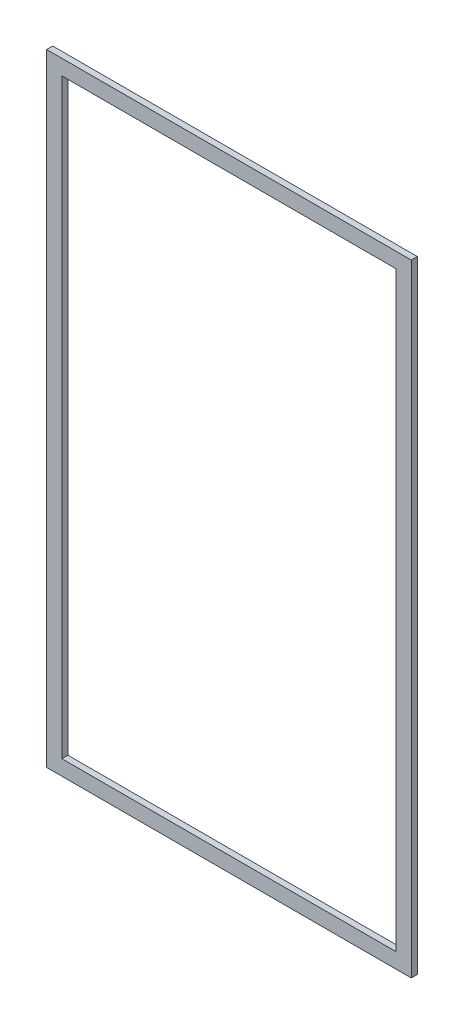
ISO-10303-21;
HEADER;
FILE_DESCRIPTION(('STEP AP214'),'2;1');
FILE_NAME('part.step','',(''),(''),'','','');
FILE_SCHEMA(('AUTOMOTIVE_DESIGN { 1 0 10303 214 1 1 1 1 }'));
ENDSEC;
DATA;
#1=APPLICATION_CONTEXT('core data for automotive mechanical design processes');
#2=APPLICATION_PROTOCOL_DEFINITION('international standard','automotive_design',2000,#1);
#3=PRODUCT_CONTEXT('',#1,'mechanical');
#4=PRODUCT('Part','Part','',(#3));
#5=PRODUCT_RELATED_PRODUCT_CATEGORY('part','',(#4));
#6=PRODUCT_DEFINITION_FORMATION('','',#4);
#7=PRODUCT_DEFINITION_CONTEXT('part definition',#1,'design');
#8=PRODUCT_DEFINITION('design','',#6,#7);
#9=PRODUCT_DEFINITION_SHAPE('','',#8);
#10=(LENGTH_UNIT() NAMED_UNIT(*) SI_UNIT(.MILLI.,.METRE.));
#11=(NAMED_UNIT(*) PLANE_ANGLE_UNIT() SI_UNIT($,.RADIAN.));
#12=(NAMED_UNIT(*) SI_UNIT($,.STERADIAN.) SOLID_ANGLE_UNIT());
#13=UNCERTAINTY_MEASURE_WITH_UNIT(LENGTH_MEASURE(1.E-05),#10,'distance_accuracy_value','');
#14=(GEOMETRIC_REPRESENTATION_CONTEXT(3) GLOBAL_UNCERTAINTY_ASSIGNED_CONTEXT((#13)) GLOBAL_UNIT_ASSIGNED_CONTEXT((#10,
#11,#12)) REPRESENTATION_CONTEXT('',''));
#15=CARTESIAN_POINT('',(0.,0.,0.));
#16=DIRECTION('',(0.,0.,1.));
#17=DIRECTION('',(1.,0.,0.));
#18=AXIS2_PLACEMENT_3D('',#15,#16,#17);
#19=CARTESIAN_POINT('',(0.,0.,10.));
#20=DIRECTION('',(0.,0.,1.));
#21=DIRECTION('',(1.,0.,0.));
#22=AXIS2_PLACEMENT_3D('',#19,#20,#21);
#23=PLANE('',#22);
#24=DIRECTION('',(0.,-1.,0.));
#25=VECTOR('',#24,1.);
#26=CARTESIAN_POINT('',(-300.,-511.5,10.));
#27=LINE('',#26,#25);
#28=CARTESIAN_POINT('',(-300.,511.5,10.));
#29=VERTEX_POINT('',#28);
#30=CARTESIAN_POINT('',(-300.,-511.5,10.));
#31=VERTEX_POINT('',#30);
#32=EDGE_CURVE('E134',#29,#31,#27,.T.);
#33=ORIENTED_EDGE('',*,*,#32,.T.);
#34=DIRECTION('',(1.,0.,0.));
#35=VECTOR('',#34,1.);
#36=CARTESIAN_POINT('',(300.,-511.5,10.));
#37=LINE('',#36,#35);
#38=CARTESIAN_POINT('',(300.,-511.5,10.));
#39=VERTEX_POINT('',#38);
#40=EDGE_CURVE('E137',#31,#39,#37,.T.);
#41=ORIENTED_EDGE('',*,*,#40,.T.);
#42=DIRECTION('',(0.,1.,0.));
#43=VECTOR('',#42,1.);
#44=CARTESIAN_POINT('',(300.,-511.5,10.));
#45=LINE('',#44,#43);
#46=CARTESIAN_POINT('',(300.,511.5,10.));
#47=VERTEX_POINT('',#46);
#48=EDGE_CURVE('E140',#39,#47,#45,.T.);
#49=ORIENTED_EDGE('',*,*,#48,.T.);
#50=DIRECTION('',(-1.,0.,0.));
#51=VECTOR('',#50,1.);
#52=CARTESIAN_POINT('',(300.,511.5,10.));
#53=LINE('',#52,#51);
#54=EDGE_CURVE('E142',#47,#29,#53,.T.);
#55=ORIENTED_EDGE('',*,*,#54,.T.);
#56=EDGE_LOOP('',(#33,#41,#49,#55));
#57=FACE_BOUND('',#56,.T.);
#58=DIRECTION('',(1.,0.,0.));
#59=VECTOR('',#58,1.);
#60=CARTESIAN_POINT('',(275.,-486.5,10.));
#61=LINE('',#60,#59);
#62=CARTESIAN_POINT('',(-275.,-486.5,10.));
#63=VERTEX_POINT('',#62);
#64=CARTESIAN_POINT('',(275.,-486.5,10.));
#65=VERTEX_POINT('',#64);
#66=EDGE_CURVE('E106',#63,#65,#61,.T.);
#67=ORIENTED_EDGE('',*,*,#66,.F.);
#68=DIRECTION('',(0.,-1.,0.));
#69=VECTOR('',#68,1.);
#70=CARTESIAN_POINT('',(-275.,-486.5,10.));
#71=LINE('',#70,#69);
#72=CARTESIAN_POINT('',(-275.,486.5,10.));
#73=VERTEX_POINT('',#72);
#74=EDGE_CURVE('E98',#73,#63,#71,.T.);
#75=ORIENTED_EDGE('',*,*,#74,.F.);
#76=DIRECTION('',(-1.,0.,0.));
#77=VECTOR('',#76,1.);
#78=CARTESIAN_POINT('',(275.,486.5,10.));
#79=LINE('',#78,#77);
#80=CARTESIAN_POINT('',(275.,486.5,10.));
#81=VERTEX_POINT('',#80);
#82=EDGE_CURVE('E120',#81,#73,#79,.T.);
#83=ORIENTED_EDGE('',*,*,#82,.F.);
#84=DIRECTION('',(0.,1.,0.));
#85=VECTOR('',#84,1.);
#86=CARTESIAN_POINT('',(275.,-486.5,10.));
#87=LINE('',#86,#85);
#88=EDGE_CURVE('E118',#65,#81,#87,.T.);
#89=ORIENTED_EDGE('',*,*,#88,.F.);
#90=EDGE_LOOP('',(#67,#75,#83,#89));
#91=FACE_BOUND('',#90,.T.);
#92=ADVANCED_FACE('F33',(#57,#91),#23,.T.);
#93=CARTESIAN_POINT('',(0.,0.,0.));
#94=DIRECTION('',(0.,0.,1.));
#95=DIRECTION('',(1.,0.,0.));
#96=AXIS2_PLACEMENT_3D('',#93,#94,#95);
#97=PLANE('',#96);
#98=DIRECTION('',(0.,-1.,0.));
#99=VECTOR('',#98,1.);
#100=CARTESIAN_POINT('',(-300.,-511.5,0.));
#101=LINE('',#100,#99);
#102=CARTESIAN_POINT('',(-300.,511.5,0.));
#103=VERTEX_POINT('',#102);
#104=CARTESIAN_POINT('',(-300.,-511.5,0.));
#105=VERTEX_POINT('',#104);
#106=EDGE_CURVE('E114',#103,#105,#101,.T.);
#107=ORIENTED_EDGE('',*,*,#106,.F.);
#108=DIRECTION('',(-1.,0.,0.));
#109=VECTOR('',#108,1.);
#110=CARTESIAN_POINT('',(300.,511.5,0.));
#111=LINE('',#110,#109);
#112=CARTESIAN_POINT('',(300.,511.5,0.));
#113=VERTEX_POINT('',#112);
#114=EDGE_CURVE('E138',#113,#103,#111,.T.);
#115=ORIENTED_EDGE('',*,*,#114,.F.);
#116=DIRECTION('',(0.,1.,0.));
#117=VECTOR('',#116,1.);
#118=CARTESIAN_POINT('',(300.,-511.5,0.));
#119=LINE('',#118,#117);
#120=CARTESIAN_POINT('',(300.,-511.5,0.));
#121=VERTEX_POINT('',#120);
#122=EDGE_CURVE('E149',#121,#113,#119,.T.);
#123=ORIENTED_EDGE('',*,*,#122,.F.);
#124=DIRECTION('',(1.,0.,0.));
#125=VECTOR('',#124,1.);
#126=CARTESIAN_POINT('',(300.,-511.5,0.));
#127=LINE('',#126,#125);
#128=EDGE_CURVE('E147',#105,#121,#127,.T.);
#129=ORIENTED_EDGE('',*,*,#128,.F.);
#130=EDGE_LOOP('',(#107,#115,#123,#129));
#131=FACE_BOUND('',#130,.T.);
#132=DIRECTION('',(0.,-1.,0.));
#133=VECTOR('',#132,1.);
#134=CARTESIAN_POINT('',(-275.,-486.5,0.));
#135=LINE('',#134,#133);
#136=CARTESIAN_POINT('',(-275.,486.5,0.));
#137=VERTEX_POINT('',#136);
#138=CARTESIAN_POINT('',(-275.,-486.5,0.));
#139=VERTEX_POINT('',#138);
#140=EDGE_CURVE('E56',#137,#139,#135,.T.);
#141=ORIENTED_EDGE('',*,*,#140,.T.);
#142=DIRECTION('',(1.,0.,0.));
#143=VECTOR('',#142,1.);
#144=CARTESIAN_POINT('',(275.,-486.5,0.));
#145=LINE('',#144,#143);
#146=CARTESIAN_POINT('',(275.,-486.5,0.));
#147=VERTEX_POINT('',#146);
#148=EDGE_CURVE('E113',#139,#147,#145,.T.);
#149=ORIENTED_EDGE('',*,*,#148,.T.);
#150=DIRECTION('',(0.,1.,0.));
#151=VECTOR('',#150,1.);
#152=CARTESIAN_POINT('',(275.,-486.5,0.));
#153=LINE('',#152,#151);
#154=CARTESIAN_POINT('',(275.,486.5,0.));
#155=VERTEX_POINT('',#154);
#156=EDGE_CURVE('E126',#147,#155,#153,.T.);
#157=ORIENTED_EDGE('',*,*,#156,.T.);
#158=DIRECTION('',(-1.,0.,0.));
#159=VECTOR('',#158,1.);
#160=CARTESIAN_POINT('',(275.,486.5,0.));
#161=LINE('',#160,#159);
#162=EDGE_CURVE('E107',#155,#137,#161,.T.);
#163=ORIENTED_EDGE('',*,*,#162,.T.);
#164=EDGE_LOOP('',(#141,#149,#157,#163));
#165=FACE_BOUND('',#164,.T.);
#166=ADVANCED_FACE('F167',(#131,#165),#97,.F.);
#167=CARTESIAN_POINT('',(-300.,-511.5,10.));
#168=DIRECTION('',(1.,0.,0.));
#169=DIRECTION('',(0.,1.,0.));
#170=AXIS2_PLACEMENT_3D('',#167,#168,#169);
#171=PLANE('',#170);
#172=ORIENTED_EDGE('',*,*,#106,.T.);
#173=DIRECTION('',(0.,0.,-1.));
#174=VECTOR('',#173,1.);
#175=CARTESIAN_POINT('',(-300.,-511.5,10.));
#176=LINE('',#175,#174);
#177=EDGE_CURVE('E11',#31,#105,#176,.T.);
#178=ORIENTED_EDGE('',*,*,#177,.F.);
#179=ORIENTED_EDGE('',*,*,#32,.F.);
#180=DIRECTION('',(0.,0.,-1.));
#181=VECTOR('',#180,1.);
#182=CARTESIAN_POINT('',(-300.,511.5,10.));
#183=LINE('',#182,#181);
#184=EDGE_CURVE('E144',#29,#103,#183,.T.);
#185=ORIENTED_EDGE('',*,*,#184,.T.);
#186=EDGE_LOOP('',(#172,#178,#179,#185));
#187=FACE_BOUND('',#186,.T.);
#188=ADVANCED_FACE('F35',(#187),#171,.F.);
#189=CARTESIAN_POINT('',(300.,-511.5,10.));
#190=DIRECTION('',(0.,1.,0.));
#191=DIRECTION('',(-1.,0.,0.));
#192=AXIS2_PLACEMENT_3D('',#189,#190,#191);
#193=PLANE('',#192);
#194=ORIENTED_EDGE('',*,*,#128,.T.);
#195=DIRECTION('',(0.,0.,-1.));
#196=VECTOR('',#195,1.);
#197=CARTESIAN_POINT('',(300.,-511.5,10.));
#198=LINE('',#197,#196);
#199=EDGE_CURVE('E41',#39,#121,#198,.T.);
#200=ORIENTED_EDGE('',*,*,#199,.F.);
#201=ORIENTED_EDGE('',*,*,#40,.F.);
#202=ORIENTED_EDGE('',*,*,#177,.T.);
#203=EDGE_LOOP('',(#194,#200,#201,#202));
#204=FACE_BOUND('',#203,.T.);
#205=ADVANCED_FACE('F177',(#204),#193,.F.);
#206=CARTESIAN_POINT('',(300.,-511.5,10.));
#207=DIRECTION('',(-1.,0.,0.));
#208=DIRECTION('',(0.,0.,1.));
#209=AXIS2_PLACEMENT_3D('',#206,#207,#208);
#210=PLANE('',#209);
#211=ORIENTED_EDGE('',*,*,#122,.T.);
#212=DIRECTION('',(0.,0.,-1.));
#213=VECTOR('',#212,1.);
#214=CARTESIAN_POINT('',(300.,511.5,10.));
#215=LINE('',#214,#213);
#216=EDGE_CURVE('E154',#47,#113,#215,.T.);
#217=ORIENTED_EDGE('',*,*,#216,.F.);
#218=ORIENTED_EDGE('',*,*,#48,.F.);
#219=ORIENTED_EDGE('',*,*,#199,.T.);
#220=EDGE_LOOP('',(#211,#217,#218,#219));
#221=FACE_BOUND('',#220,.T.);
#222=ADVANCED_FACE('F161',(#221),#210,.F.);
#223=CARTESIAN_POINT('',(300.,511.5,10.));
#224=DIRECTION('',(0.,-1.,0.));
#225=DIRECTION('',(0.,0.,-1.));
#226=AXIS2_PLACEMENT_3D('',#223,#224,#225);
#227=PLANE('',#226);
#228=ORIENTED_EDGE('',*,*,#114,.T.);
#229=ORIENTED_EDGE('',*,*,#184,.F.);
#230=ORIENTED_EDGE('',*,*,#54,.F.);
#231=ORIENTED_EDGE('',*,*,#216,.T.);
#232=EDGE_LOOP('',(#228,#229,#230,#231));
#233=FACE_BOUND('',#232,.T.);
#234=ADVANCED_FACE('F171',(#233),#227,.F.);
#235=CARTESIAN_POINT('',(-275.,-486.5,10.));
#236=DIRECTION('',(1.,0.,0.));
#237=DIRECTION('',(0.,0.,-1.));
#238=AXIS2_PLACEMENT_3D('',#235,#236,#237);
#239=PLANE('',#238);
#240=ORIENTED_EDGE('',*,*,#140,.F.);
#241=DIRECTION('',(0.,0.,-1.));
#242=VECTOR('',#241,1.);
#243=CARTESIAN_POINT('',(-275.,486.5,10.));
#244=LINE('',#243,#242);
#245=EDGE_CURVE('E102',#73,#137,#244,.T.);
#246=ORIENTED_EDGE('',*,*,#245,.F.);
#247=ORIENTED_EDGE('',*,*,#74,.T.);
#248=DIRECTION('',(0.,0.,-1.));
#249=VECTOR('',#248,1.);
#250=CARTESIAN_POINT('',(-275.,-486.5,10.));
#251=LINE('',#250,#249);
#252=EDGE_CURVE('E101',#63,#139,#251,.T.);
#253=ORIENTED_EDGE('',*,*,#252,.T.);
#254=EDGE_LOOP('',(#240,#246,#247,#253));
#255=FACE_BOUND('',#254,.T.);
#256=ADVANCED_FACE('F100',(#255),#239,.T.);
#257=CARTESIAN_POINT('',(275.,-486.5,10.));
#258=DIRECTION('',(0.,1.,0.));
#259=DIRECTION('',(-1.,0.,0.));
#260=AXIS2_PLACEMENT_3D('',#257,#258,#259);
#261=PLANE('',#260);
#262=ORIENTED_EDGE('',*,*,#148,.F.);
#263=ORIENTED_EDGE('',*,*,#252,.F.);
#264=ORIENTED_EDGE('',*,*,#66,.T.);
#265=DIRECTION('',(0.,0.,-1.));
#266=VECTOR('',#265,1.);
#267=CARTESIAN_POINT('',(275.,-486.5,10.));
#268=LINE('',#267,#266);
#269=EDGE_CURVE('E115',#65,#147,#268,.T.);
#270=ORIENTED_EDGE('',*,*,#269,.T.);
#271=EDGE_LOOP('',(#262,#263,#264,#270));
#272=FACE_BOUND('',#271,.T.);
#273=ADVANCED_FACE('F110',(#272),#261,.T.);
#274=CARTESIAN_POINT('',(275.,-486.5,10.));
#275=DIRECTION('',(-1.,0.,0.));
#276=DIRECTION('',(0.,0.,1.));
#277=AXIS2_PLACEMENT_3D('',#274,#275,#276);
#278=PLANE('',#277);
#279=ORIENTED_EDGE('',*,*,#156,.F.);
#280=ORIENTED_EDGE('',*,*,#269,.F.);
#281=ORIENTED_EDGE('',*,*,#88,.T.);
#282=DIRECTION('',(0.,0.,-1.));
#283=VECTOR('',#282,1.);
#284=CARTESIAN_POINT('',(275.,486.5,10.));
#285=LINE('',#284,#283);
#286=EDGE_CURVE('E48',#81,#155,#285,.T.);
#287=ORIENTED_EDGE('',*,*,#286,.T.);
#288=EDGE_LOOP('',(#279,#280,#281,#287));
#289=FACE_BOUND('',#288,.T.);
#290=ADVANCED_FACE('F200',(#289),#278,.T.);
#291=CARTESIAN_POINT('',(275.,486.5,10.));
#292=DIRECTION('',(0.,-1.,0.));
#293=DIRECTION('',(1.,0.,0.));
#294=AXIS2_PLACEMENT_3D('',#291,#292,#293);
#295=PLANE('',#294);
#296=ORIENTED_EDGE('',*,*,#162,.F.);
#297=ORIENTED_EDGE('',*,*,#286,.F.);
#298=ORIENTED_EDGE('',*,*,#82,.T.);
#299=ORIENTED_EDGE('',*,*,#245,.T.);
#300=EDGE_LOOP('',(#296,#297,#298,#299));
#301=FACE_BOUND('',#300,.T.);
#302=ADVANCED_FACE('F204',(#301),#295,.T.);
#303=CLOSED_SHELL('',(#92,#166,#188,#205,#222,#234,#256,#273,#290,#302));
#304=MANIFOLD_SOLID_BREP('B2',#303);
#305=ADVANCED_BREP_SHAPE_REPRESENTATION('',(#18,#304),#14);
#306=SHAPE_DEFINITION_REPRESENTATION(#9,#305);
ENDSEC;
END-ISO-10303-21;
